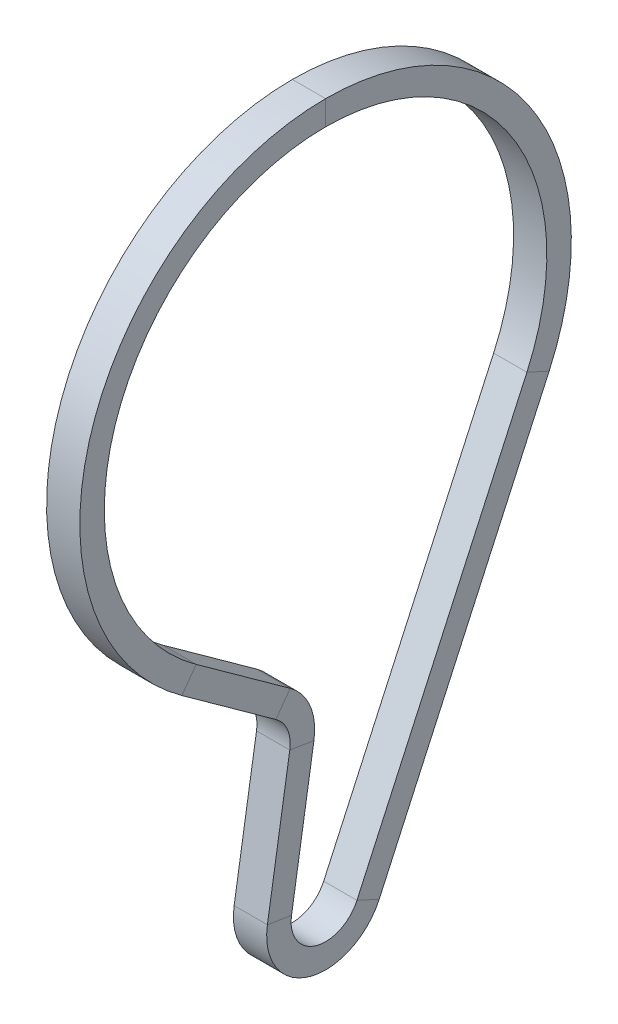
ISO-10303-21;
HEADER;
FILE_DESCRIPTION(('STEP AP214'),'2;1');
FILE_NAME('part.step','',(''),(''),'','','');
FILE_SCHEMA(('AUTOMOTIVE_DESIGN { 1 0 10303 214 1 1 1 1 }'));
ENDSEC;
DATA;
#1=APPLICATION_CONTEXT('core data for automotive mechanical design processes');
#2=APPLICATION_PROTOCOL_DEFINITION('international standard','automotive_design',2000,#1);
#3=PRODUCT_CONTEXT('',#1,'mechanical');
#4=PRODUCT('Part','Part','',(#3));
#5=PRODUCT_RELATED_PRODUCT_CATEGORY('part','',(#4));
#6=PRODUCT_DEFINITION_FORMATION('','',#4);
#7=PRODUCT_DEFINITION_CONTEXT('part definition',#1,'design');
#8=PRODUCT_DEFINITION('design','',#6,#7);
#9=PRODUCT_DEFINITION_SHAPE('','',#8);
#10=(LENGTH_UNIT() NAMED_UNIT(*) SI_UNIT(.MILLI.,.METRE.));
#11=(NAMED_UNIT(*) PLANE_ANGLE_UNIT() SI_UNIT($,.RADIAN.));
#12=(NAMED_UNIT(*) SI_UNIT($,.STERADIAN.) SOLID_ANGLE_UNIT());
#13=UNCERTAINTY_MEASURE_WITH_UNIT(LENGTH_MEASURE(1.E-05),#10,'distance_accuracy_value','');
#14=(GEOMETRIC_REPRESENTATION_CONTEXT(3) GLOBAL_UNCERTAINTY_ASSIGNED_CONTEXT((#13)) GLOBAL_UNIT_ASSIGNED_CONTEXT((#10,
#11,#12)) REPRESENTATION_CONTEXT('',''));
#15=CARTESIAN_POINT('',(0.,0.,0.));
#16=DIRECTION('',(0.,0.,1.));
#17=DIRECTION('',(1.,0.,0.));
#18=AXIS2_PLACEMENT_3D('',#15,#16,#17);
#19=CARTESIAN_POINT('',(-6.477,-77.6489995430107,55.9720029816015));
#20=DIRECTION('',(1.,0.,0.));
#21=DIRECTION('',(0.,0.,-1.));
#22=AXIS2_PLACEMENT_3D('',#19,#20,#21);
#23=PLANE('',#22);
#24=DIRECTION('',(0.,0.811213587628169,-0.584749959595925));
#25=VECTOR('',#24,1.);
#26=CARTESIAN_POINT('',(-6.477,-77.6489995430107,55.9720029816015));
#27=LINE('',#26,#25);
#28=CARTESIAN_POINT('',(-6.477,-77.6489995430107,55.9720029816015));
#29=VERTEX_POINT('',#28);
#30=CARTESIAN_POINT('',(-6.477,-69.9221901208524,50.4022596164503));
#31=VERTEX_POINT('',#30);
#32=EDGE_CURVE('E192',#29,#31,#27,.T.);
#33=ORIENTED_EDGE('',*,*,#32,.F.);
#34=CARTESIAN_POINT('',(-6.477,0.,0.));
#35=DIRECTION('',(-1.,0.,0.));
#36=DIRECTION('',(0.,-0.811213587628169,0.584749959595925));
#37=AXIS2_PLACEMENT_3D('',#34,#35,#36);
#38=CIRCLE('',#37,95.7195499770182);
#39=CARTESIAN_POINT('',(-6.477,95.7195499770182,0.));
#40=VERTEX_POINT('',#39);
#41=EDGE_CURVE('E191',#29,#40,#38,.T.);
#42=ORIENTED_EDGE('',*,*,#41,.T.);
#43=DIRECTION('',(0.,-1.,0.));
#44=VECTOR('',#43,1.);
#45=CARTESIAN_POINT('',(-6.477,95.7195499770182,0.));
#46=LINE('',#45,#44);
#47=CARTESIAN_POINT('',(-6.477,86.1945499770182,0.));
#48=VERTEX_POINT('',#47);
#49=EDGE_CURVE('E166',#40,#48,#46,.T.);
#50=ORIENTED_EDGE('',*,*,#49,.T.);
#51=CARTESIAN_POINT('',(-6.477,0.,0.));
#52=DIRECTION('',(-1.,0.,0.));
#53=DIRECTION('',(0.,-0.811213587628169,0.584749959595925));
#54=AXIS2_PLACEMENT_3D('',#51,#52,#53);
#55=CIRCLE('',#54,86.1945499770182);
#56=EDGE_CURVE('E196',#31,#48,#55,.T.);
#57=ORIENTED_EDGE('',*,*,#56,.F.);
#58=EDGE_LOOP('',(#33,#42,#50,#57));
#59=FACE_BOUND('',#58,.T.);
#60=ADVANCED_FACE('F34',(#59),#23,.F.);
#61=CARTESIAN_POINT('',(-6.477,95.7195499770182,0.));
#62=DIRECTION('',(1.,0.,0.));
#63=DIRECTION('',(0.,0.,-1.));
#64=AXIS2_PLACEMENT_3D('',#61,#62,#63);
#65=PLANE('',#64);
#66=CARTESIAN_POINT('',(-6.477,0.,0.));
#67=DIRECTION('',(-1.,0.,0.));
#68=DIRECTION('',(0.,1.,0.));
#69=AXIS2_PLACEMENT_3D('',#66,#67,#68);
#70=CIRCLE('',#69,86.1945499770182);
#71=CARTESIAN_POINT('',(-6.477,-35.7868400776274,-78.4143005006039));
#72=VERTEX_POINT('',#71);
#73=EDGE_CURVE('E172',#48,#72,#70,.T.);
#74=ORIENTED_EDGE('',*,*,#73,.F.);
#75=ORIENTED_EDGE('',*,*,#49,.F.);
#76=CARTESIAN_POINT('',(-6.477,0.,0.));
#77=DIRECTION('',(-1.,0.,0.));
#78=DIRECTION('',(0.,1.,0.));
#79=AXIS2_PLACEMENT_3D('',#76,#77,#78);
#80=CIRCLE('',#79,95.7195499770182);
#81=CARTESIAN_POINT('',(-6.477,-39.7414944244543,-87.0795376004831));
#82=VERTEX_POINT('',#81);
#83=EDGE_CURVE('E170',#40,#82,#80,.T.);
#84=ORIENTED_EDGE('',*,*,#83,.T.);
#85=DIRECTION('',(0.,0.415186808065814,0.90973617846501));
#86=VECTOR('',#85,1.);
#87=CARTESIAN_POINT('',(-6.477,-39.7414944244543,-87.0795376004831));
#88=LINE('',#87,#86);
#89=EDGE_CURVE('E188',#82,#72,#88,.T.);
#90=ORIENTED_EDGE('',*,*,#89,.T.);
#91=EDGE_LOOP('',(#74,#75,#84,#90));
#92=FACE_BOUND('',#91,.T.);
#93=ADVANCED_FACE('F168',(#92),#65,.F.);
#94=CARTESIAN_POINT('',(0.,0.,0.));
#95=DIRECTION('',(-1.,0.,0.));
#96=DIRECTION('',(0.,0.,1.));
#97=AXIS2_PLACEMENT_3D('',#94,#95,#96);
#98=CYLINDRICAL_SURFACE('',#97,86.1945499770182);
#99=CARTESIAN_POINT('',(6.477,0.,0.));
#100=DIRECTION('',(-1.,0.,0.));
#101=DIRECTION('',(0.,1.,0.));
#102=AXIS2_PLACEMENT_3D('',#99,#100,#101);
#103=CIRCLE('',#102,86.1945499770182);
#104=CARTESIAN_POINT('',(6.477,86.1945499770182,0.));
#105=VERTEX_POINT('',#104);
#106=CARTESIAN_POINT('',(6.477,-35.7868400776274,-78.4143005006039));
#107=VERTEX_POINT('',#106);
#108=EDGE_CURVE('E243',#105,#107,#103,.T.);
#109=ORIENTED_EDGE('',*,*,#108,.F.);
#110=DIRECTION('',(1.,0.,0.));
#111=VECTOR('',#110,1.);
#112=CARTESIAN_POINT('',(-6.477,86.1945499770182,0.));
#113=LINE('',#112,#111);
#114=EDGE_CURVE('E177',#48,#105,#113,.T.);
#115=ORIENTED_EDGE('',*,*,#114,.F.);
#116=ORIENTED_EDGE('',*,*,#73,.T.);
#117=DIRECTION('',(1.,0.,0.));
#118=VECTOR('',#117,1.);
#119=CARTESIAN_POINT('',(-6.477,-35.7868400776274,-78.4143005006039));
#120=LINE('',#119,#118);
#121=EDGE_CURVE('E289',#72,#107,#120,.T.);
#122=ORIENTED_EDGE('',*,*,#121,.T.);
#123=EDGE_LOOP('',(#109,#115,#116,#122));
#124=FACE_BOUND('',#123,.T.);
#125=ADVANCED_FACE('F317',(#124),#98,.F.);
#126=CARTESIAN_POINT('',(6.477,95.7195499770182,0.));
#127=DIRECTION('',(-1.,0.,0.));
#128=DIRECTION('',(0.,0.,1.));
#129=AXIS2_PLACEMENT_3D('',#126,#127,#128);
#130=PLANE('',#129);
#131=CARTESIAN_POINT('',(6.477,0.,0.));
#132=DIRECTION('',(-1.,0.,0.));
#133=DIRECTION('',(0.,1.,0.));
#134=AXIS2_PLACEMENT_3D('',#131,#132,#133);
#135=CIRCLE('',#134,95.7195499770182);
#136=CARTESIAN_POINT('',(6.477,95.7195499770182,0.));
#137=VERTEX_POINT('',#136);
#138=CARTESIAN_POINT('',(6.477,-39.7414944244543,-87.0795376004831));
#139=VERTEX_POINT('',#138);
#140=EDGE_CURVE('E207',#137,#139,#135,.T.);
#141=ORIENTED_EDGE('',*,*,#140,.F.);
#142=DIRECTION('',(0.,1.,0.));
#143=VECTOR('',#142,1.);
#144=CARTESIAN_POINT('',(6.477,95.7195499770182,0.));
#145=LINE('',#144,#143);
#146=EDGE_CURVE('E199',#105,#137,#145,.T.);
#147=ORIENTED_EDGE('',*,*,#146,.F.);
#148=ORIENTED_EDGE('',*,*,#108,.T.);
#149=DIRECTION('',(0.,-0.415186808065814,-0.90973617846501));
#150=VECTOR('',#149,1.);
#151=CARTESIAN_POINT('',(6.477,-39.7414944244543,-87.0795376004831));
#152=LINE('',#151,#150);
#153=EDGE_CURVE('E246',#107,#139,#152,.T.);
#154=ORIENTED_EDGE('',*,*,#153,.T.);
#155=EDGE_LOOP('',(#141,#147,#148,#154));
#156=FACE_BOUND('',#155,.T.);
#157=ADVANCED_FACE('F241',(#156),#130,.F.);
#158=CARTESIAN_POINT('',(0.,0.,0.));
#159=DIRECTION('',(-1.,0.,0.));
#160=DIRECTION('',(0.,0.,1.));
#161=AXIS2_PLACEMENT_3D('',#158,#159,#160);
#162=CYLINDRICAL_SURFACE('',#161,95.7195499770182);
#163=DIRECTION('',(-1.,0.,0.));
#164=VECTOR('',#163,1.);
#165=CARTESIAN_POINT('',(-6.477,-39.7414944244543,-87.0795376004831));
#166=LINE('',#165,#164);
#167=EDGE_CURVE('E186',#139,#82,#166,.T.);
#168=ORIENTED_EDGE('',*,*,#167,.T.);
#169=ORIENTED_EDGE('',*,*,#83,.F.);
#170=DIRECTION('',(-1.,0.,0.));
#171=VECTOR('',#170,1.);
#172=CARTESIAN_POINT('',(-6.477,95.7195499770182,0.));
#173=LINE('',#172,#171);
#174=EDGE_CURVE('E184',#137,#40,#173,.T.);
#175=ORIENTED_EDGE('',*,*,#174,.F.);
#176=ORIENTED_EDGE('',*,*,#140,.T.);
#177=EDGE_LOOP('',(#168,#169,#175,#176));
#178=FACE_BOUND('',#177,.T.);
#179=ADVANCED_FACE('F182',(#178),#162,.T.);
#180=CARTESIAN_POINT('',(-6.477,-39.7414944244544,-87.0795376004831));
#181=DIRECTION('',(1.,0.,0.));
#182=DIRECTION('',(0.,0.,-1.));
#183=AXIS2_PLACEMENT_3D('',#180,#181,#182);
#184=PLANE('',#183);
#185=DIRECTION('',(0.,-0.90973617846501,0.415186808065814));
#186=VECTOR('',#185,1.);
#187=CARTESIAN_POINT('',(-6.477,-35.7868400776275,-78.4143005006038));
#188=LINE('',#187,#186);
#189=CARTESIAN_POINT('',(-6.477,-180.835506276795,-12.2167652601691));
#190=VERTEX_POINT('',#189);
#191=EDGE_CURVE('E295',#72,#190,#188,.T.);
#192=ORIENTED_EDGE('',*,*,#191,.F.);
#193=ORIENTED_EDGE('',*,*,#89,.F.);
#194=DIRECTION('',(0.,-0.90973617846501,0.415186808065814));
#195=VECTOR('',#194,1.);
#196=CARTESIAN_POINT('',(-6.477,-39.7414944244544,-87.0795376004831));
#197=LINE('',#196,#195);
#198=CARTESIAN_POINT('',(-6.477,-184.790160623622,-20.8820023600483));
#199=VERTEX_POINT('',#198);
#200=EDGE_CURVE('E206',#82,#199,#197,.T.);
#201=ORIENTED_EDGE('',*,*,#200,.T.);
#202=DIRECTION('',(0.,0.415186808065814,0.90973617846501));
#203=VECTOR('',#202,1.);
#204=CARTESIAN_POINT('',(-6.477,-184.790160623622,-20.8820023600483));
#205=LINE('',#204,#203);
#206=EDGE_CURVE('E335',#199,#190,#205,.T.);
#207=ORIENTED_EDGE('',*,*,#206,.T.);
#208=EDGE_LOOP('',(#192,#193,#201,#207));
#209=FACE_BOUND('',#208,.T.);
#210=ADVANCED_FACE('F386',(#209),#184,.F.);
#211=CARTESIAN_POINT('',(-6.477,-35.7868400776275,-78.4143005006038));
#212=DIRECTION('',(0.,-0.415186808065814,-0.90973617846501));
#213=DIRECTION('',(0.,0.90973617846501,-0.415186808065814));
#214=AXIS2_PLACEMENT_3D('',#211,#212,#213);
#215=PLANE('',#214);
#216=DIRECTION('',(0.,-0.90973617846501,0.415186808065814));
#217=VECTOR('',#216,1.);
#218=CARTESIAN_POINT('',(6.477,-35.7868400776275,-78.4143005006038));
#219=LINE('',#218,#217);
#220=CARTESIAN_POINT('',(6.477,-180.835506276795,-12.2167652601691));
#221=VERTEX_POINT('',#220);
#222=EDGE_CURVE('E254',#107,#221,#219,.T.);
#223=ORIENTED_EDGE('',*,*,#222,.F.);
#224=ORIENTED_EDGE('',*,*,#121,.F.);
#225=ORIENTED_EDGE('',*,*,#191,.T.);
#226=DIRECTION('',(1.,0.,0.));
#227=VECTOR('',#226,1.);
#228=CARTESIAN_POINT('',(-6.477,-180.835506276795,-12.2167652601691));
#229=LINE('',#228,#227);
#230=EDGE_CURVE('E292',#190,#221,#229,.T.);
#231=ORIENTED_EDGE('',*,*,#230,.T.);
#232=EDGE_LOOP('',(#223,#224,#225,#231));
#233=FACE_BOUND('',#232,.T.);
#234=ADVANCED_FACE('F321',(#233),#215,.F.);
#235=CARTESIAN_POINT('',(6.477,-39.7414944244544,-87.0795376004831));
#236=DIRECTION('',(-1.,0.,0.));
#237=DIRECTION('',(0.,0.,1.));
#238=AXIS2_PLACEMENT_3D('',#235,#236,#237);
#239=PLANE('',#238);
#240=DIRECTION('',(0.,-0.90973617846501,0.415186808065814));
#241=VECTOR('',#240,1.);
#242=CARTESIAN_POINT('',(6.477,-39.7414944244544,-87.0795376004831));
#243=LINE('',#242,#241);
#244=CARTESIAN_POINT('',(6.477,-184.790160623622,-20.8820023600483));
#245=VERTEX_POINT('',#244);
#246=EDGE_CURVE('E212',#139,#245,#243,.T.);
#247=ORIENTED_EDGE('',*,*,#246,.F.);
#248=ORIENTED_EDGE('',*,*,#153,.F.);
#249=ORIENTED_EDGE('',*,*,#222,.T.);
#250=DIRECTION('',(0.,-0.415186808065814,-0.90973617846501));
#251=VECTOR('',#250,1.);
#252=CARTESIAN_POINT('',(6.477,-184.790160623622,-20.8820023600483));
#253=LINE('',#252,#251);
#254=EDGE_CURVE('E251',#221,#245,#253,.T.);
#255=ORIENTED_EDGE('',*,*,#254,.T.);
#256=EDGE_LOOP('',(#247,#248,#249,#255));
#257=FACE_BOUND('',#256,.T.);
#258=ADVANCED_FACE('F325',(#257),#239,.F.);
#259=CARTESIAN_POINT('',(-6.477,-39.7414944244544,-87.0795376004831));
#260=DIRECTION('',(0.,0.415186808065814,0.90973617846501));
#261=DIRECTION('',(0.,-0.90973617846501,0.415186808065814));
#262=AXIS2_PLACEMENT_3D('',#259,#260,#261);
#263=PLANE('',#262);
#264=DIRECTION('',(-1.,0.,0.));
#265=VECTOR('',#264,1.);
#266=CARTESIAN_POINT('',(-6.477,-184.790160623622,-20.8820023600483));
#267=LINE('',#266,#265);
#268=EDGE_CURVE('E208',#245,#199,#267,.T.);
#269=ORIENTED_EDGE('',*,*,#268,.T.);
#270=ORIENTED_EDGE('',*,*,#200,.F.);
#271=ORIENTED_EDGE('',*,*,#167,.F.);
#272=ORIENTED_EDGE('',*,*,#246,.T.);
#273=EDGE_LOOP('',(#269,#270,#271,#272));
#274=FACE_BOUND('',#273,.T.);
#275=ADVANCED_FACE('F329',(#274),#263,.F.);
#276=CARTESIAN_POINT('',(-6.477,-184.790160623622,-20.8820023600483));
#277=DIRECTION('',(1.,0.,0.));
#278=DIRECTION('',(0.,0.,-1.));
#279=AXIS2_PLACEMENT_3D('',#276,#277,#278);
#280=PLANE('',#279);
#281=CARTESIAN_POINT('',(-6.477,-175.26,0.));
#282=DIRECTION('',(-1.,0.,0.));
#283=DIRECTION('',(0.,-0.415186808065816,-0.909736178465009));
#284=AXIS2_PLACEMENT_3D('',#281,#282,#283);
#285=CIRCLE('',#284,13.4289099954036);
#286=CARTESIAN_POINT('',(-6.477,-173.141980385709,13.2608301617255));
#287=VERTEX_POINT('',#286);
#288=EDGE_CURVE('E300',#190,#287,#285,.T.);
#289=ORIENTED_EDGE('',*,*,#288,.F.);
#290=ORIENTED_EDGE('',*,*,#206,.F.);
#291=CARTESIAN_POINT('',(-6.477,-175.26,0.));
#292=DIRECTION('',(-1.,0.,0.));
#293=DIRECTION('',(0.,-0.415186808065815,-0.90973617846501));
#294=AXIS2_PLACEMENT_3D('',#291,#292,#293);
#295=CIRCLE('',#294,22.9539099954036);
#296=CARTESIAN_POINT('',(-6.477,-171.639688924002,22.6666127109918));
#297=VERTEX_POINT('',#296);
#298=EDGE_CURVE('E211',#199,#297,#295,.T.);
#299=ORIENTED_EDGE('',*,*,#298,.T.);
#300=DIRECTION('',(0.,-0.15772088836817,-0.987483732206438));
#301=VECTOR('',#300,1.);
#302=CARTESIAN_POINT('',(-6.477,-171.639688924002,22.6666127109918));
#303=LINE('',#302,#301);
#304=EDGE_CURVE('E261',#297,#287,#303,.T.);
#305=ORIENTED_EDGE('',*,*,#304,.T.);
#306=EDGE_LOOP('',(#289,#290,#299,#305));
#307=FACE_BOUND('',#306,.T.);
#308=ADVANCED_FACE('F359',(#307),#280,.F.);
#309=CARTESIAN_POINT('',(0.,-175.26,0.));
#310=DIRECTION('',(-1.,0.,0.));
#311=DIRECTION('',(0.,0.,1.));
#312=AXIS2_PLACEMENT_3D('',#309,#310,#311);
#313=CYLINDRICAL_SURFACE('',#312,13.4289099954036);
#314=CARTESIAN_POINT('',(6.477,-175.26,0.));
#315=DIRECTION('',(-1.,0.,0.));
#316=DIRECTION('',(0.,-0.415186808065816,-0.909736178465009));
#317=AXIS2_PLACEMENT_3D('',#314,#315,#316);
#318=CIRCLE('',#317,13.4289099954036);
#319=CARTESIAN_POINT('',(6.477,-173.141980385709,13.2608301617255));
#320=VERTEX_POINT('',#319);
#321=EDGE_CURVE('E262',#221,#320,#318,.T.);
#322=ORIENTED_EDGE('',*,*,#321,.F.);
#323=ORIENTED_EDGE('',*,*,#230,.F.);
#324=ORIENTED_EDGE('',*,*,#288,.T.);
#325=DIRECTION('',(1.,0.,0.));
#326=VECTOR('',#325,1.);
#327=CARTESIAN_POINT('',(-6.477,-173.141980385709,13.2608301617255));
#328=LINE('',#327,#326);
#329=EDGE_CURVE('E258',#287,#320,#328,.T.);
#330=ORIENTED_EDGE('',*,*,#329,.T.);
#331=EDGE_LOOP('',(#322,#323,#324,#330));
#332=FACE_BOUND('',#331,.T.);
#333=ADVANCED_FACE('F356',(#332),#313,.F.);
#334=CARTESIAN_POINT('',(6.477,-184.790160623622,-20.8820023600483));
#335=DIRECTION('',(-1.,0.,0.));
#336=DIRECTION('',(0.,0.,1.));
#337=AXIS2_PLACEMENT_3D('',#334,#335,#336);
#338=PLANE('',#337);
#339=CARTESIAN_POINT('',(6.477,-175.26,0.));
#340=DIRECTION('',(-1.,0.,0.));
#341=DIRECTION('',(0.,-0.415186808065815,-0.90973617846501));
#342=AXIS2_PLACEMENT_3D('',#339,#340,#341);
#343=CIRCLE('',#342,22.9539099954036);
#344=CARTESIAN_POINT('',(6.477,-171.639688924002,22.6666127109918));
#345=VERTEX_POINT('',#344);
#346=EDGE_CURVE('E259',#245,#345,#343,.T.);
#347=ORIENTED_EDGE('',*,*,#346,.F.);
#348=ORIENTED_EDGE('',*,*,#254,.F.);
#349=ORIENTED_EDGE('',*,*,#321,.T.);
#350=DIRECTION('',(0.,0.15772088836817,0.987483732206438));
#351=VECTOR('',#350,1.);
#352=CARTESIAN_POINT('',(6.477,-171.639688924002,22.6666127109918));
#353=LINE('',#352,#351);
#354=EDGE_CURVE('E217',#320,#345,#353,.T.);
#355=ORIENTED_EDGE('',*,*,#354,.T.);
#356=EDGE_LOOP('',(#347,#348,#349,#355));
#357=FACE_BOUND('',#356,.T.);
#358=ADVANCED_FACE('F354',(#357),#338,.F.);
#359=CARTESIAN_POINT('',(0.,-175.26,0.));
#360=DIRECTION('',(-1.,0.,0.));
#361=DIRECTION('',(0.,0.,1.));
#362=AXIS2_PLACEMENT_3D('',#359,#360,#361);
#363=CYLINDRICAL_SURFACE('',#362,22.9539099954036);
#364=DIRECTION('',(-1.,0.,0.));
#365=VECTOR('',#364,1.);
#366=CARTESIAN_POINT('',(-6.477,-171.639688924002,22.6666127109918));
#367=LINE('',#366,#365);
#368=EDGE_CURVE('E213',#345,#297,#367,.T.);
#369=ORIENTED_EDGE('',*,*,#368,.T.);
#370=ORIENTED_EDGE('',*,*,#298,.F.);
#371=ORIENTED_EDGE('',*,*,#268,.F.);
#372=ORIENTED_EDGE('',*,*,#346,.T.);
#373=EDGE_LOOP('',(#369,#370,#371,#372));
#374=FACE_BOUND('',#373,.T.);
#375=ADVANCED_FACE('F361',(#374),#363,.T.);
#376=CARTESIAN_POINT('',(-6.477,-171.639688924002,22.6666127109918));
#377=DIRECTION('',(1.,0.,0.));
#378=DIRECTION('',(0.,0.,-1.));
#379=AXIS2_PLACEMENT_3D('',#376,#377,#378);
#380=PLANE('',#379);
#381=DIRECTION('',(0.,0.987483732206438,-0.15772088836817));
#382=VECTOR('',#381,1.);
#383=CARTESIAN_POINT('',(-6.477,-173.141980385709,13.2608301617255));
#384=LINE('',#383,#382);
#385=CARTESIAN_POINT('',(-6.477,-118.556688500715,4.54246807924283));
#386=VERTEX_POINT('',#385);
#387=EDGE_CURVE('E143',#287,#386,#384,.T.);
#388=ORIENTED_EDGE('',*,*,#387,.F.);
#389=ORIENTED_EDGE('',*,*,#304,.F.);
#390=DIRECTION('',(0.,0.987483732206438,-0.15772088836817));
#391=VECTOR('',#390,1.);
#392=CARTESIAN_POINT('',(-6.477,-171.639688924002,22.6666127109918));
#393=LINE('',#392,#391);
#394=CARTESIAN_POINT('',(-6.477,-117.054397039008,13.9482506285091));
#395=VERTEX_POINT('',#394);
#396=EDGE_CURVE('E216',#297,#395,#393,.T.);
#397=ORIENTED_EDGE('',*,*,#396,.T.);
#398=DIRECTION('',(0.,-0.15772088836817,-0.987483732206438));
#399=VECTOR('',#398,1.);
#400=CARTESIAN_POINT('',(-6.477,-117.054397039008,13.9482506285091));
#401=LINE('',#400,#399);
#402=EDGE_CURVE('E344',#395,#386,#401,.T.);
#403=ORIENTED_EDGE('',*,*,#402,.T.);
#404=EDGE_LOOP('',(#388,#389,#397,#403));
#405=FACE_BOUND('',#404,.T.);
#406=ADVANCED_FACE('F349',(#405),#380,.F.);
#407=CARTESIAN_POINT('',(-6.477,-173.141980385709,13.2608301617255));
#408=DIRECTION('',(0.,0.15772088836817,0.987483732206437));
#409=DIRECTION('',(0.,-0.987483732206437,0.15772088836817));
#410=AXIS2_PLACEMENT_3D('',#407,#408,#409);
#411=PLANE('',#410);
#412=DIRECTION('',(0.,0.987483732206438,-0.15772088836817));
#413=VECTOR('',#412,1.);
#414=CARTESIAN_POINT('',(6.477,-173.141980385709,13.2608301617255));
#415=LINE('',#414,#413);
#416=CARTESIAN_POINT('',(6.477,-118.556688500715,4.54246807924283));
#417=VERTEX_POINT('',#416);
#418=EDGE_CURVE('E137',#320,#417,#415,.T.);
#419=ORIENTED_EDGE('',*,*,#418,.F.);
#420=ORIENTED_EDGE('',*,*,#329,.F.);
#421=ORIENTED_EDGE('',*,*,#387,.T.);
#422=DIRECTION('',(1.,0.,0.));
#423=VECTOR('',#422,1.);
#424=CARTESIAN_POINT('',(-6.477,-118.556688500715,4.54246807924283));
#425=LINE('',#424,#423);
#426=EDGE_CURVE('E301',#386,#417,#425,.T.);
#427=ORIENTED_EDGE('',*,*,#426,.T.);
#428=EDGE_LOOP('',(#419,#420,#421,#427));
#429=FACE_BOUND('',#428,.T.);
#430=ADVANCED_FACE('F352',(#429),#411,.F.);
#431=CARTESIAN_POINT('',(6.477,-171.639688924002,22.6666127109918));
#432=DIRECTION('',(-1.,0.,0.));
#433=DIRECTION('',(0.,0.,1.));
#434=AXIS2_PLACEMENT_3D('',#431,#432,#433);
#435=PLANE('',#434);
#436=DIRECTION('',(0.,0.987483732206438,-0.15772088836817));
#437=VECTOR('',#436,1.);
#438=CARTESIAN_POINT('',(6.477,-171.639688924002,22.6666127109918));
#439=LINE('',#438,#437);
#440=CARTESIAN_POINT('',(6.477,-117.054397039008,13.9482506285091));
#441=VERTEX_POINT('',#440);
#442=EDGE_CURVE('E221',#345,#441,#439,.T.);
#443=ORIENTED_EDGE('',*,*,#442,.F.);
#444=ORIENTED_EDGE('',*,*,#354,.F.);
#445=ORIENTED_EDGE('',*,*,#418,.T.);
#446=DIRECTION('',(0.,0.15772088836817,0.987483732206438));
#447=VECTOR('',#446,1.);
#448=CARTESIAN_POINT('',(6.477,-117.054397039008,13.9482506285091));
#449=LINE('',#448,#447);
#450=EDGE_CURVE('E263',#417,#441,#449,.T.);
#451=ORIENTED_EDGE('',*,*,#450,.T.);
#452=EDGE_LOOP('',(#443,#444,#445,#451));
#453=FACE_BOUND('',#452,.T.);
#454=ADVANCED_FACE('F269',(#453),#435,.F.);
#455=CARTESIAN_POINT('',(-6.477,-171.639688924002,22.6666127109918));
#456=DIRECTION('',(0.,-0.15772088836817,-0.987483732206437));
#457=DIRECTION('',(0.,0.987483732206437,-0.15772088836817));
#458=AXIS2_PLACEMENT_3D('',#455,#456,#457);
#459=PLANE('',#458);
#460=DIRECTION('',(-1.,0.,0.));
#461=VECTOR('',#460,1.);
#462=CARTESIAN_POINT('',(-6.477,-117.054397039008,13.9482506285091));
#463=LINE('',#462,#461);
#464=EDGE_CURVE('E218',#441,#395,#463,.T.);
#465=ORIENTED_EDGE('',*,*,#464,.T.);
#466=ORIENTED_EDGE('',*,*,#396,.F.);
#467=ORIENTED_EDGE('',*,*,#368,.F.);
#468=ORIENTED_EDGE('',*,*,#442,.T.);
#469=EDGE_LOOP('',(#465,#466,#467,#468));
#470=FACE_BOUND('',#469,.T.);
#471=ADVANCED_FACE('F267',(#470),#459,.F.);
#472=CARTESIAN_POINT('',(-6.477,-117.054397039008,13.9482506285091));
#473=DIRECTION('',(1.,0.,0.));
#474=DIRECTION('',(0.,0.,-1.));
#475=AXIS2_PLACEMENT_3D('',#472,#473,#474);
#476=PLANE('',#475);
#477=CARTESIAN_POINT('',(-6.477,-114.936377424717,27.2090807902347));
#478=DIRECTION('',(1.,0.,0.));
#479=DIRECTION('',(0.,-0.15772088836817,-0.987483732206438));
#480=AXIS2_PLACEMENT_3D('',#477,#478,#479);
#481=CIRCLE('',#480,22.9539099954037);
#482=CARTESIAN_POINT('',(-6.477,-96.3158537472514,13.7867828478539));
#483=VERTEX_POINT('',#482);
#484=EDGE_CURVE('E114',#386,#483,#481,.T.);
#485=ORIENTED_EDGE('',*,*,#484,.F.);
#486=ORIENTED_EDGE('',*,*,#402,.F.);
#487=CARTESIAN_POINT('',(-6.477,-114.936377424717,27.2090807902347));
#488=DIRECTION('',(1.,0.,0.));
#489=DIRECTION('',(0.,-0.15772088836817,-0.987483732206438));
#490=AXIS2_PLACEMENT_3D('',#487,#488,#489);
#491=CIRCLE('',#490,13.4289099954036);
#492=CARTESIAN_POINT('',(-6.477,-104.04266316941,19.3565262130051));
#493=VERTEX_POINT('',#492);
#494=EDGE_CURVE('E220',#395,#493,#491,.T.);
#495=ORIENTED_EDGE('',*,*,#494,.T.);
#496=DIRECTION('',(0.,0.811213587628169,-0.584749959595925));
#497=VECTOR('',#496,1.);
#498=CARTESIAN_POINT('',(-6.477,-104.04266316941,19.3565262130051));
#499=LINE('',#498,#497);
#500=EDGE_CURVE('E275',#493,#483,#499,.T.);
#501=ORIENTED_EDGE('',*,*,#500,.T.);
#502=EDGE_LOOP('',(#485,#486,#495,#501));
#503=FACE_BOUND('',#502,.T.);
#504=ADVANCED_FACE('F350',(#503),#476,.F.);
#505=CARTESIAN_POINT('',(0.,-114.936377424717,27.2090807902347));
#506=DIRECTION('',(1.,0.,0.));
#507=DIRECTION('',(0.,0.,-1.));
#508=AXIS2_PLACEMENT_3D('',#505,#506,#507);
#509=CYLINDRICAL_SURFACE('',#508,22.9539099954037);
#510=CARTESIAN_POINT('',(6.477,-114.936377424717,27.2090807902347));
#511=DIRECTION('',(1.,0.,0.));
#512=DIRECTION('',(0.,-0.15772088836817,-0.987483732206438));
#513=AXIS2_PLACEMENT_3D('',#510,#511,#512);
#514=CIRCLE('',#513,22.9539099954037);
#515=CARTESIAN_POINT('',(6.477,-96.3158537472514,13.7867828478539));
#516=VERTEX_POINT('',#515);
#517=EDGE_CURVE('E107',#417,#516,#514,.T.);
#518=ORIENTED_EDGE('',*,*,#517,.F.);
#519=ORIENTED_EDGE('',*,*,#426,.F.);
#520=ORIENTED_EDGE('',*,*,#484,.T.);
#521=DIRECTION('',(1.,0.,0.));
#522=VECTOR('',#521,1.);
#523=CARTESIAN_POINT('',(-6.477,-96.3158537472514,13.7867828478539));
#524=LINE('',#523,#522);
#525=EDGE_CURVE('E304',#483,#516,#524,.T.);
#526=ORIENTED_EDGE('',*,*,#525,.T.);
#527=EDGE_LOOP('',(#518,#519,#520,#526));
#528=FACE_BOUND('',#527,.T.);
#529=ADVANCED_FACE('F351',(#528),#509,.T.);
#530=CARTESIAN_POINT('',(6.477,-117.054397039008,13.9482506285091));
#531=DIRECTION('',(-1.,0.,0.));
#532=DIRECTION('',(0.,0.,1.));
#533=AXIS2_PLACEMENT_3D('',#530,#531,#532);
#534=PLANE('',#533);
#535=CARTESIAN_POINT('',(6.477,-114.936377424717,27.2090807902347));
#536=DIRECTION('',(1.,0.,0.));
#537=DIRECTION('',(0.,-0.15772088836817,-0.987483732206438));
#538=AXIS2_PLACEMENT_3D('',#535,#536,#537);
#539=CIRCLE('',#538,13.4289099954036);
#540=CARTESIAN_POINT('',(6.477,-104.04266316941,19.3565262130051));
#541=VERTEX_POINT('',#540);
#542=EDGE_CURVE('E98',#441,#541,#539,.T.);
#543=ORIENTED_EDGE('',*,*,#542,.F.);
#544=ORIENTED_EDGE('',*,*,#450,.F.);
#545=ORIENTED_EDGE('',*,*,#517,.T.);
#546=DIRECTION('',(0.,-0.811213587628169,0.584749959595925));
#547=VECTOR('',#546,1.);
#548=CARTESIAN_POINT('',(6.477,-104.04266316941,19.3565262130051));
#549=LINE('',#548,#547);
#550=EDGE_CURVE('E227',#516,#541,#549,.T.);
#551=ORIENTED_EDGE('',*,*,#550,.T.);
#552=EDGE_LOOP('',(#543,#544,#545,#551));
#553=FACE_BOUND('',#552,.T.);
#554=ADVANCED_FACE('F270',(#553),#534,.F.);
#555=CARTESIAN_POINT('',(0.,-114.936377424717,27.2090807902347));
#556=DIRECTION('',(1.,0.,0.));
#557=DIRECTION('',(0.,0.,-1.));
#558=AXIS2_PLACEMENT_3D('',#555,#556,#557);
#559=CYLINDRICAL_SURFACE('',#558,13.4289099954036);
#560=DIRECTION('',(-1.,0.,0.));
#561=VECTOR('',#560,1.);
#562=CARTESIAN_POINT('',(-6.477,-104.04266316941,19.3565262130051));
#563=LINE('',#562,#561);
#564=EDGE_CURVE('E222',#541,#493,#563,.T.);
#565=ORIENTED_EDGE('',*,*,#564,.T.);
#566=ORIENTED_EDGE('',*,*,#494,.F.);
#567=ORIENTED_EDGE('',*,*,#464,.F.);
#568=ORIENTED_EDGE('',*,*,#542,.T.);
#569=EDGE_LOOP('',(#565,#566,#567,#568));
#570=FACE_BOUND('',#569,.T.);
#571=ADVANCED_FACE('F271',(#570),#559,.F.);
#572=CARTESIAN_POINT('',(-6.477,-104.04266316941,19.3565262130051));
#573=DIRECTION('',(1.,0.,0.));
#574=DIRECTION('',(0.,1.,0.));
#575=AXIS2_PLACEMENT_3D('',#572,#573,#574);
#576=PLANE('',#575);
#577=DIRECTION('',(0.,0.584749959595924,0.811213587628169));
#578=VECTOR('',#577,1.);
#579=CARTESIAN_POINT('',(-6.477,-96.3158537472514,13.7867828478539));
#580=LINE('',#579,#578);
#581=EDGE_CURVE('E281',#483,#31,#580,.T.);
#582=ORIENTED_EDGE('',*,*,#581,.F.);
#583=ORIENTED_EDGE('',*,*,#500,.F.);
#584=DIRECTION('',(0.,0.584749959595924,0.811213587628169));
#585=VECTOR('',#584,1.);
#586=CARTESIAN_POINT('',(-6.477,-104.04266316941,19.3565262130051));
#587=LINE('',#586,#585);
#588=EDGE_CURVE('E223',#493,#29,#587,.T.);
#589=ORIENTED_EDGE('',*,*,#588,.T.);
#590=ORIENTED_EDGE('',*,*,#32,.T.);
#591=EDGE_LOOP('',(#582,#583,#589,#590));
#592=FACE_BOUND('',#591,.T.);
#593=ADVANCED_FACE('F380',(#592),#576,.F.);
#594=CARTESIAN_POINT('',(-6.477,-96.3158537472514,13.7867828478539));
#595=DIRECTION('',(0.,-0.811213587628169,0.584749959595924));
#596=DIRECTION('',(0.,-0.584749959595924,-0.811213587628169));
#597=AXIS2_PLACEMENT_3D('',#594,#595,#596);
#598=PLANE('',#597);
#599=DIRECTION('',(0.,0.584749959595924,0.811213587628169));
#600=VECTOR('',#599,1.);
#601=CARTESIAN_POINT('',(6.477,-96.3158537472514,13.7867828478539));
#602=LINE('',#601,#600);
#603=CARTESIAN_POINT('',(6.477,-69.9221901208524,50.4022596164503));
#604=VERTEX_POINT('',#603);
#605=EDGE_CURVE('E59',#516,#604,#602,.T.);
#606=ORIENTED_EDGE('',*,*,#605,.F.);
#607=ORIENTED_EDGE('',*,*,#525,.F.);
#608=ORIENTED_EDGE('',*,*,#581,.T.);
#609=DIRECTION('',(1.,0.,0.));
#610=VECTOR('',#609,1.);
#611=CARTESIAN_POINT('',(-6.477,-69.9221901208524,50.4022596164503));
#612=LINE('',#611,#610);
#613=EDGE_CURVE('E283',#31,#604,#612,.T.);
#614=ORIENTED_EDGE('',*,*,#613,.T.);
#615=EDGE_LOOP('',(#606,#607,#608,#614));
#616=FACE_BOUND('',#615,.T.);
#617=ADVANCED_FACE('F311',(#616),#598,.F.);
#618=CARTESIAN_POINT('',(6.477,-104.04266316941,19.3565262130051));
#619=DIRECTION('',(-1.,0.,0.));
#620=DIRECTION('',(0.,-1.,0.));
#621=AXIS2_PLACEMENT_3D('',#618,#619,#620);
#622=PLANE('',#621);
#623=DIRECTION('',(0.,0.584749959595924,0.811213587628169));
#624=VECTOR('',#623,1.);
#625=CARTESIAN_POINT('',(6.477,-104.04266316941,19.3565262130051));
#626=LINE('',#625,#624);
#627=CARTESIAN_POINT('',(6.477,-77.6489995430107,55.9720029816015));
#628=VERTEX_POINT('',#627);
#629=EDGE_CURVE('E51',#541,#628,#626,.T.);
#630=ORIENTED_EDGE('',*,*,#629,.F.);
#631=ORIENTED_EDGE('',*,*,#550,.F.);
#632=ORIENTED_EDGE('',*,*,#605,.T.);
#633=DIRECTION('',(0.,-0.811213587628169,0.584749959595925));
#634=VECTOR('',#633,1.);
#635=CARTESIAN_POINT('',(6.477,-77.6489995430107,55.9720029816015));
#636=LINE('',#635,#634);
#637=EDGE_CURVE('E232',#604,#628,#636,.T.);
#638=ORIENTED_EDGE('',*,*,#637,.T.);
#639=EDGE_LOOP('',(#630,#631,#632,#638));
#640=FACE_BOUND('',#639,.T.);
#641=ADVANCED_FACE('F395',(#640),#622,.F.);
#642=CARTESIAN_POINT('',(-6.477,-104.04266316941,19.3565262130051));
#643=DIRECTION('',(0.,0.811213587628169,-0.584749959595924));
#644=DIRECTION('',(0.,0.584749959595924,0.811213587628169));
#645=AXIS2_PLACEMENT_3D('',#642,#643,#644);
#646=PLANE('',#645);
#647=DIRECTION('',(-1.,0.,0.));
#648=VECTOR('',#647,1.);
#649=CARTESIAN_POINT('',(-6.477,-77.6489995430107,55.9720029816015));
#650=LINE('',#649,#648);
#651=EDGE_CURVE('E38',#628,#29,#650,.T.);
#652=ORIENTED_EDGE('',*,*,#651,.T.);
#653=ORIENTED_EDGE('',*,*,#588,.F.);
#654=ORIENTED_EDGE('',*,*,#564,.F.);
#655=ORIENTED_EDGE('',*,*,#629,.T.);
#656=EDGE_LOOP('',(#652,#653,#654,#655));
#657=FACE_BOUND('',#656,.T.);
#658=ADVANCED_FACE('F233',(#657),#646,.F.);
#659=CARTESIAN_POINT('',(0.,0.,0.));
#660=DIRECTION('',(-1.,0.,0.));
#661=DIRECTION('',(0.,0.,1.));
#662=AXIS2_PLACEMENT_3D('',#659,#660,#661);
#663=CYLINDRICAL_SURFACE('',#662,86.1945499770182);
#664=ORIENTED_EDGE('',*,*,#56,.T.);
#665=ORIENTED_EDGE('',*,*,#114,.T.);
#666=CARTESIAN_POINT('',(6.477,0.,0.));
#667=DIRECTION('',(-1.,0.,0.));
#668=DIRECTION('',(0.,-0.811213587628169,0.584749959595925));
#669=AXIS2_PLACEMENT_3D('',#666,#667,#668);
#670=CIRCLE('',#669,86.1945499770182);
#671=EDGE_CURVE('E43',#604,#105,#670,.T.);
#672=ORIENTED_EDGE('',*,*,#671,.F.);
#673=ORIENTED_EDGE('',*,*,#613,.F.);
#674=EDGE_LOOP('',(#664,#665,#672,#673));
#675=FACE_BOUND('',#674,.T.);
#676=ADVANCED_FACE('F315',(#675),#663,.F.);
#677=CARTESIAN_POINT('',(6.477,-77.6489995430107,55.9720029816015));
#678=DIRECTION('',(-1.,0.,0.));
#679=DIRECTION('',(0.,0.,1.));
#680=AXIS2_PLACEMENT_3D('',#677,#678,#679);
#681=PLANE('',#680);
#682=ORIENTED_EDGE('',*,*,#671,.T.);
#683=ORIENTED_EDGE('',*,*,#146,.T.);
#684=CARTESIAN_POINT('',(6.477,0.,0.));
#685=DIRECTION('',(-1.,0.,0.));
#686=DIRECTION('',(0.,-0.811213587628169,0.584749959595925));
#687=AXIS2_PLACEMENT_3D('',#684,#685,#686);
#688=CIRCLE('',#687,95.7195499770182);
#689=EDGE_CURVE('E11',#628,#137,#688,.T.);
#690=ORIENTED_EDGE('',*,*,#689,.F.);
#691=ORIENTED_EDGE('',*,*,#637,.F.);
#692=EDGE_LOOP('',(#682,#683,#690,#691));
#693=FACE_BOUND('',#692,.T.);
#694=ADVANCED_FACE('F237',(#693),#681,.F.);
#695=CARTESIAN_POINT('',(0.,0.,0.));
#696=DIRECTION('',(-1.,0.,0.));
#697=DIRECTION('',(0.,0.,1.));
#698=AXIS2_PLACEMENT_3D('',#695,#696,#697);
#699=CYLINDRICAL_SURFACE('',#698,95.7195499770182);
#700=ORIENTED_EDGE('',*,*,#689,.T.);
#701=ORIENTED_EDGE('',*,*,#174,.T.);
#702=ORIENTED_EDGE('',*,*,#41,.F.);
#703=ORIENTED_EDGE('',*,*,#651,.F.);
#704=EDGE_LOOP('',(#700,#701,#702,#703));
#705=FACE_BOUND('',#704,.T.);
#706=ADVANCED_FACE('F36',(#705),#699,.T.);
#707=CLOSED_SHELL('',(#60,#93,#125,#157,#179,#210,#234,#258,#275,#308,#333,#358,#375,#406,#430,
#454,#471,#504,#529,#554,#571,#593,#617,#641,#658,#676,#694,#706));
#708=MANIFOLD_SOLID_BREP('B2',#707);
#709=ADVANCED_BREP_SHAPE_REPRESENTATION('',(#18,#708),#14);
#710=SHAPE_DEFINITION_REPRESENTATION(#9,#709);
ENDSEC;
END-ISO-10303-21;
